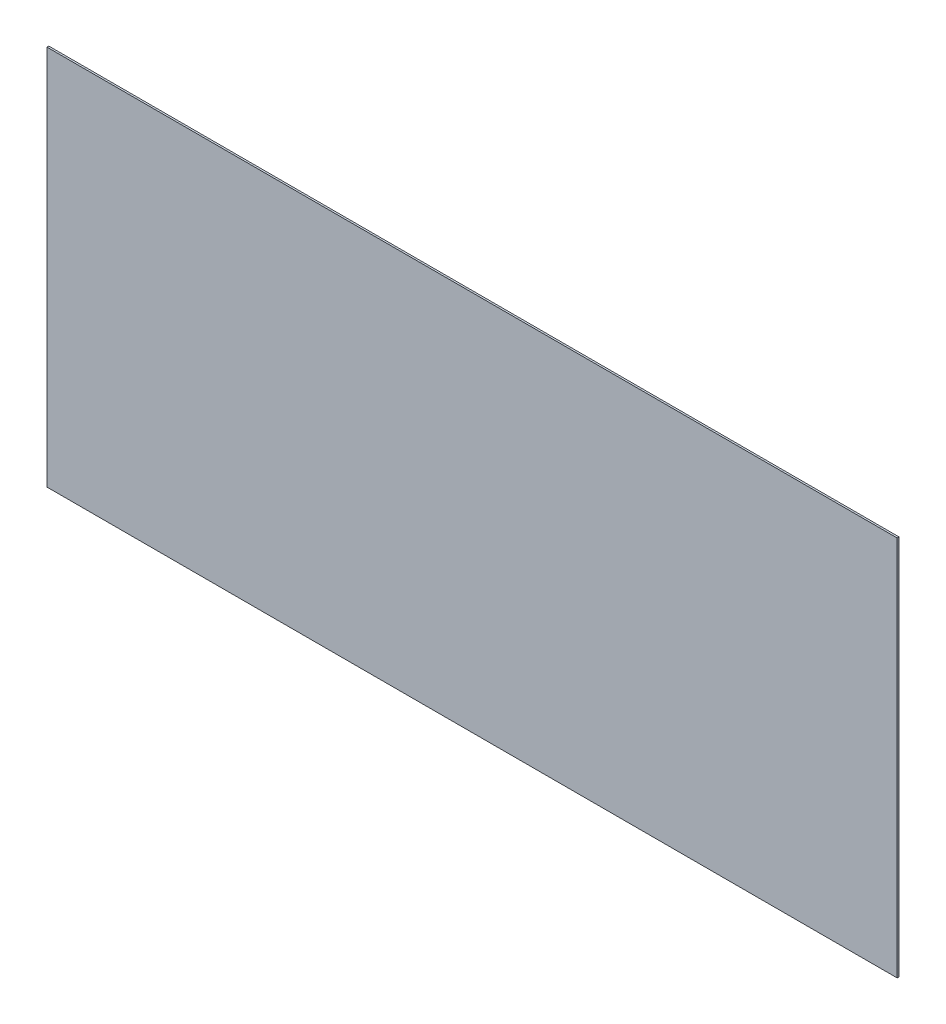
ISO-10303-21;
HEADER;
FILE_DESCRIPTION(('STEP AP214'),'2;1');
FILE_NAME('part.step','',(''),(''),'','','');
FILE_SCHEMA(('AUTOMOTIVE_DESIGN { 1 0 10303 214 1 1 1 1 }'));
ENDSEC;
DATA;
#1=APPLICATION_CONTEXT('core data for automotive mechanical design processes');
#2=APPLICATION_PROTOCOL_DEFINITION('international standard','automotive_design',2000,#1);
#3=PRODUCT_CONTEXT('',#1,'mechanical');
#4=PRODUCT('Part','Part','',(#3));
#5=PRODUCT_RELATED_PRODUCT_CATEGORY('part','',(#4));
#6=PRODUCT_DEFINITION_FORMATION('','',#4);
#7=PRODUCT_DEFINITION_CONTEXT('part definition',#1,'design');
#8=PRODUCT_DEFINITION('design','',#6,#7);
#9=PRODUCT_DEFINITION_SHAPE('','',#8);
#10=(LENGTH_UNIT() NAMED_UNIT(*) SI_UNIT(.MILLI.,.METRE.));
#11=(NAMED_UNIT(*) PLANE_ANGLE_UNIT() SI_UNIT($,.RADIAN.));
#12=(NAMED_UNIT(*) SI_UNIT($,.STERADIAN.) SOLID_ANGLE_UNIT());
#13=UNCERTAINTY_MEASURE_WITH_UNIT(LENGTH_MEASURE(1.E-05),#10,'distance_accuracy_value','');
#14=(GEOMETRIC_REPRESENTATION_CONTEXT(3) GLOBAL_UNCERTAINTY_ASSIGNED_CONTEXT((#13)) GLOBAL_UNIT_ASSIGNED_CONTEXT((#10,
#11,#12)) REPRESENTATION_CONTEXT('',''));
#15=CARTESIAN_POINT('',(0.,0.,0.));
#16=DIRECTION('',(0.,0.,1.));
#17=DIRECTION('',(1.,0.,0.));
#18=AXIS2_PLACEMENT_3D('',#15,#16,#17);
#19=CARTESIAN_POINT('',(-125.,-60.,151.2));
#20=DIRECTION('',(1.,0.,0.));
#21=DIRECTION('',(0.,1.,0.));
#22=AXIS2_PLACEMENT_3D('',#19,#20,#21);
#23=PLANE('',#22);
#24=DIRECTION('',(0.,-1.,0.));
#25=VECTOR('',#24,1.);
#26=CARTESIAN_POINT('',(-125.,-60.,151.));
#27=LINE('',#26,#25);
#28=CARTESIAN_POINT('',(-125.,60.,151.));
#29=VERTEX_POINT('',#28);
#30=CARTESIAN_POINT('',(-125.,19.,151.));
#31=VERTEX_POINT('',#30);
#32=EDGE_CURVE('E101',#29,#31,#27,.T.);
#33=ORIENTED_EDGE('',*,*,#32,.T.);
#34=DIRECTION('',(0.,0.,1.));
#35=VECTOR('',#34,1.);
#36=CARTESIAN_POINT('',(-125.,19.,141.2));
#37=LINE('',#36,#35);
#38=CARTESIAN_POINT('',(-125.,19.,151.2));
#39=VERTEX_POINT('',#38);
#40=EDGE_CURVE('E104',#31,#39,#37,.T.);
#41=ORIENTED_EDGE('',*,*,#40,.T.);
#42=DIRECTION('',(0.,-1.,0.));
#43=VECTOR('',#42,1.);
#44=CARTESIAN_POINT('',(-125.,-60.,151.2));
#45=LINE('',#44,#43);
#46=CARTESIAN_POINT('',(-125.,60.,151.2));
#47=VERTEX_POINT('',#46);
#48=EDGE_CURVE('E95',#47,#39,#45,.T.);
#49=ORIENTED_EDGE('',*,*,#48,.F.);
#50=DIRECTION('',(0.,0.,-1.));
#51=VECTOR('',#50,1.);
#52=CARTESIAN_POINT('',(-125.,60.,151.2));
#53=LINE('',#52,#51);
#54=EDGE_CURVE('E93',#47,#29,#53,.T.);
#55=ORIENTED_EDGE('',*,*,#54,.T.);
#56=EDGE_LOOP('',(#33,#41,#49,#55));
#57=FACE_BOUND('',#56,.T.);
#58=ADVANCED_FACE('F41',(#57),#23,.F.);
#59=CARTESIAN_POINT('',(-125.,60.,151.2));
#60=DIRECTION('',(0.,-1.,0.));
#61=DIRECTION('',(1.,0.,0.));
#62=AXIS2_PLACEMENT_3D('',#59,#60,#61);
#63=PLANE('',#62);
#64=DIRECTION('',(-1.,0.,0.));
#65=VECTOR('',#64,1.);
#66=CARTESIAN_POINT('',(-125.,60.,151.2));
#67=LINE('',#66,#65);
#68=CARTESIAN_POINT('',(-33.5,60.,151.2));
#69=VERTEX_POINT('',#68);
#70=EDGE_CURVE('E63',#69,#47,#67,.T.);
#71=ORIENTED_EDGE('',*,*,#70,.F.);
#72=DIRECTION('',(0.,0.,1.));
#73=VECTOR('',#72,1.);
#74=CARTESIAN_POINT('',(-33.5,60.,141.2));
#75=LINE('',#74,#73);
#76=CARTESIAN_POINT('',(-33.5,60.,151.));
#77=VERTEX_POINT('',#76);
#78=EDGE_CURVE('E80',#77,#69,#75,.T.);
#79=ORIENTED_EDGE('',*,*,#78,.F.);
#80=DIRECTION('',(-1.,0.,0.));
#81=VECTOR('',#80,1.);
#82=CARTESIAN_POINT('',(-125.,60.,151.));
#83=LINE('',#82,#81);
#84=EDGE_CURVE('E98',#77,#29,#83,.T.);
#85=ORIENTED_EDGE('',*,*,#84,.T.);
#86=ORIENTED_EDGE('',*,*,#54,.F.);
#87=EDGE_LOOP('',(#71,#79,#85,#86));
#88=FACE_BOUND('',#87,.T.);
#89=ADVANCED_FACE('F91',(#88),#63,.F.);
#90=CARTESIAN_POINT('',(0.,0.,151.2));
#91=DIRECTION('',(0.,0.,-1.));
#92=DIRECTION('',(-1.,0.,0.));
#93=AXIS2_PLACEMENT_3D('',#90,#91,#92);
#94=PLANE('',#93);
#95=ORIENTED_EDGE('',*,*,#48,.T.);
#96=DIRECTION('',(-1.,0.,0.));
#97=VECTOR('',#96,1.);
#98=CARTESIAN_POINT('',(-125.,19.,151.2));
#99=LINE('',#98,#97);
#100=CARTESIAN_POINT('',(-33.5,19.,151.2));
#101=VERTEX_POINT('',#100);
#102=EDGE_CURVE('E87',#101,#39,#99,.T.);
#103=ORIENTED_EDGE('',*,*,#102,.F.);
#104=DIRECTION('',(0.,-1.,0.));
#105=VECTOR('',#104,1.);
#106=CARTESIAN_POINT('',(-33.5,60.,151.2));
#107=LINE('',#106,#105);
#108=EDGE_CURVE('E82',#69,#101,#107,.T.);
#109=ORIENTED_EDGE('',*,*,#108,.F.);
#110=ORIENTED_EDGE('',*,*,#70,.T.);
#111=EDGE_LOOP('',(#95,#103,#109,#110));
#112=FACE_BOUND('',#111,.T.);
#113=ADVANCED_FACE('F89',(#112),#94,.F.);
#114=CARTESIAN_POINT('',(0.,0.,151.));
#115=DIRECTION('',(0.,0.,-1.));
#116=DIRECTION('',(-1.,0.,0.));
#117=AXIS2_PLACEMENT_3D('',#114,#115,#116);
#118=PLANE('',#117);
#119=DIRECTION('',(1.,0.,0.));
#120=VECTOR('',#119,1.);
#121=CARTESIAN_POINT('',(0.,19.,151.));
#122=LINE('',#121,#120);
#123=CARTESIAN_POINT('',(-33.5,19.,151.));
#124=VERTEX_POINT('',#123);
#125=EDGE_CURVE('E11',#31,#124,#122,.T.);
#126=ORIENTED_EDGE('',*,*,#125,.F.);
#127=ORIENTED_EDGE('',*,*,#32,.F.);
#128=ORIENTED_EDGE('',*,*,#84,.F.);
#129=DIRECTION('',(0.,1.,0.));
#130=VECTOR('',#129,1.);
#131=CARTESIAN_POINT('',(-33.5,0.,151.));
#132=LINE('',#131,#130);
#133=EDGE_CURVE('E48',#124,#77,#132,.T.);
#134=ORIENTED_EDGE('',*,*,#133,.F.);
#135=EDGE_LOOP('',(#126,#127,#128,#134));
#136=FACE_BOUND('',#135,.T.);
#137=ADVANCED_FACE('F110',(#136),#118,.T.);
#138=CARTESIAN_POINT('',(-125.,19.,141.2));
#139=DIRECTION('',(0.,1.,0.));
#140=DIRECTION('',(-1.,0.,0.));
#141=AXIS2_PLACEMENT_3D('',#138,#139,#140);
#142=PLANE('',#141);
#143=ORIENTED_EDGE('',*,*,#125,.T.);
#144=DIRECTION('',(0.,0.,1.));
#145=VECTOR('',#144,1.);
#146=CARTESIAN_POINT('',(-33.5,19.,141.2));
#147=LINE('',#146,#145);
#148=EDGE_CURVE('E55',#124,#101,#147,.T.);
#149=ORIENTED_EDGE('',*,*,#148,.T.);
#150=ORIENTED_EDGE('',*,*,#102,.T.);
#151=ORIENTED_EDGE('',*,*,#40,.F.);
#152=EDGE_LOOP('',(#143,#149,#150,#151));
#153=FACE_BOUND('',#152,.T.);
#154=ADVANCED_FACE('F112',(#153),#142,.F.);
#155=CARTESIAN_POINT('',(-33.5,60.,141.2));
#156=DIRECTION('',(-1.,0.,0.));
#157=DIRECTION('',(0.,0.,1.));
#158=AXIS2_PLACEMENT_3D('',#155,#156,#157);
#159=PLANE('',#158);
#160=ORIENTED_EDGE('',*,*,#133,.T.);
#161=ORIENTED_EDGE('',*,*,#78,.T.);
#162=ORIENTED_EDGE('',*,*,#108,.T.);
#163=ORIENTED_EDGE('',*,*,#148,.F.);
#164=EDGE_LOOP('',(#160,#161,#162,#163));
#165=FACE_BOUND('',#164,.T.);
#166=ADVANCED_FACE('F81',(#165),#159,.F.);
#167=CLOSED_SHELL('',(#58,#89,#113,#137,#154,#166));
#168=MANIFOLD_SOLID_BREP('B2',#167);
#169=ADVANCED_BREP_SHAPE_REPRESENTATION('',(#18,#168),#14);
#170=SHAPE_DEFINITION_REPRESENTATION(#9,#169);
ENDSEC;
END-ISO-10303-21;
